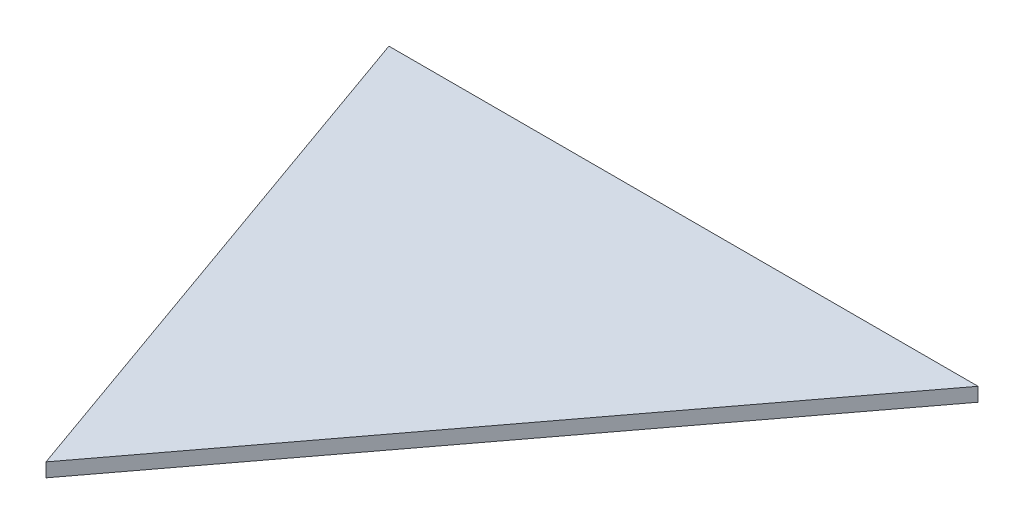
ISO-10303-21;
HEADER;
FILE_DESCRIPTION(('STEP AP214'),'2;1');
FILE_NAME('part.step','',(''),(''),'','','');
FILE_SCHEMA(('AUTOMOTIVE_DESIGN { 1 0 10303 214 1 1 1 1 }'));
ENDSEC;
DATA;
#1=APPLICATION_CONTEXT('core data for automotive mechanical design processes');
#2=APPLICATION_PROTOCOL_DEFINITION('international standard','automotive_design',2000,#1);
#3=PRODUCT_CONTEXT('',#1,'mechanical');
#4=PRODUCT('Part','Part','',(#3));
#5=PRODUCT_RELATED_PRODUCT_CATEGORY('part','',(#4));
#6=PRODUCT_DEFINITION_FORMATION('','',#4);
#7=PRODUCT_DEFINITION_CONTEXT('part definition',#1,'design');
#8=PRODUCT_DEFINITION('design','',#6,#7);
#9=PRODUCT_DEFINITION_SHAPE('','',#8);
#10=(LENGTH_UNIT() NAMED_UNIT(*) SI_UNIT(.MILLI.,.METRE.));
#11=(NAMED_UNIT(*) PLANE_ANGLE_UNIT() SI_UNIT($,.RADIAN.));
#12=(NAMED_UNIT(*) SI_UNIT($,.STERADIAN.) SOLID_ANGLE_UNIT());
#13=UNCERTAINTY_MEASURE_WITH_UNIT(LENGTH_MEASURE(1.E-05),#10,'distance_accuracy_value','');
#14=(GEOMETRIC_REPRESENTATION_CONTEXT(3) GLOBAL_UNCERTAINTY_ASSIGNED_CONTEXT((#13)) GLOBAL_UNIT_ASSIGNED_CONTEXT((#10,
#11,#12)) REPRESENTATION_CONTEXT('',''));
#15=CARTESIAN_POINT('',(0.,0.,0.));
#16=DIRECTION('',(0.,0.,1.));
#17=DIRECTION('',(1.,0.,0.));
#18=AXIS2_PLACEMENT_3D('',#15,#16,#17);
#19=CARTESIAN_POINT('',(-57.15,152.4,0.));
#20=DIRECTION('',(0.,0.,1.));
#21=DIRECTION('',(1.,0.,0.));
#22=AXIS2_PLACEMENT_3D('',#19,#20,#21);
#23=PLANE('',#22);
#24=DIRECTION('',(-1.,0.,0.));
#25=VECTOR('',#24,1.);
#26=CARTESIAN_POINT('',(224.536,145.785416666667,0.));
#27=LINE('',#26,#25);
#28=CARTESIAN_POINT('',(224.536,145.785416666667,0.));
#29=VERTEX_POINT('',#28);
#30=CARTESIAN_POINT('',(-57.15,145.785416666667,0.));
#31=VERTEX_POINT('',#30);
#32=EDGE_CURVE('E73',#29,#31,#27,.T.);
#33=ORIENTED_EDGE('',*,*,#32,.T.);
#34=DIRECTION('',(0.,-1.,0.));
#35=VECTOR('',#34,1.);
#36=CARTESIAN_POINT('',(-57.15,152.4,0.));
#37=LINE('',#36,#35);
#38=CARTESIAN_POINT('',(-57.15,152.4,0.));
#39=VERTEX_POINT('',#38);
#40=EDGE_CURVE('E93',#39,#31,#37,.T.);
#41=ORIENTED_EDGE('',*,*,#40,.F.);
#42=DIRECTION('',(-1.,0.,0.));
#43=VECTOR('',#42,1.);
#44=CARTESIAN_POINT('',(-57.15,152.4,0.));
#45=LINE('',#44,#43);
#46=CARTESIAN_POINT('',(224.536,152.4,0.));
#47=VERTEX_POINT('',#46);
#48=EDGE_CURVE('E91',#47,#39,#45,.T.);
#49=ORIENTED_EDGE('',*,*,#48,.F.);
#50=DIRECTION('',(0.,-1.,0.));
#51=VECTOR('',#50,1.);
#52=CARTESIAN_POINT('',(224.536,152.4,0.));
#53=LINE('',#52,#51);
#54=EDGE_CURVE('E49',#47,#29,#53,.T.);
#55=ORIENTED_EDGE('',*,*,#54,.T.);
#56=EDGE_LOOP('',(#33,#41,#49,#55));
#57=FACE_BOUND('',#56,.T.);
#58=ADVANCED_FACE('F40',(#57),#23,.F.);
#59=CARTESIAN_POINT('',(-24.3576833527357,152.4,196.753899883586));
#60=DIRECTION('',(0.986393923832144,0.,-0.164398987305357));
#61=DIRECTION('',(-0.164398987305357,0.,-0.986393923832144));
#62=AXIS2_PLACEMENT_3D('',#59,#60,#61);
#63=PLANE('',#62);
#64=DIRECTION('',(-0.157990501106673,0.276483376936678,-0.947943006640037));
#65=VECTOR('',#64,1.);
#66=CARTESIAN_POINT('',(-27.1533648645131,93.2913051795645,179.979810812922));
#67=LINE('',#66,#65);
#68=CARTESIAN_POINT('',(-24.3576833527357,88.3988625339542,196.753899883586));
#69=VERTEX_POINT('',#68);
#70=EDGE_CURVE('E78',#69,#31,#67,.T.);
#71=ORIENTED_EDGE('',*,*,#70,.F.);
#72=DIRECTION('',(0.,-1.,0.));
#73=VECTOR('',#72,1.);
#74=CARTESIAN_POINT('',(-24.3576833527357,152.4,196.753899883586));
#75=LINE('',#74,#73);
#76=CARTESIAN_POINT('',(-24.3576833527357,95.0134458672875,196.753899883586));
#77=VERTEX_POINT('',#76);
#78=EDGE_CURVE('E12',#77,#69,#75,.T.);
#79=ORIENTED_EDGE('',*,*,#78,.F.);
#80=DIRECTION('',(-0.157990501106673,0.276483376936678,-0.947943006640037));
#81=VECTOR('',#80,1.);
#82=CARTESIAN_POINT('',(-26.8644283070508,99.4002495373389,181.713430157695));
#83=LINE('',#82,#81);
#84=EDGE_CURVE('E60',#77,#39,#83,.T.);
#85=ORIENTED_EDGE('',*,*,#84,.T.);
#86=ORIENTED_EDGE('',*,*,#40,.T.);
#87=EDGE_LOOP('',(#71,#79,#85,#86));
#88=FACE_BOUND('',#87,.T.);
#89=ADVANCED_FACE('F42',(#88),#63,.F.);
#90=CARTESIAN_POINT('',(224.536,152.4,0.));
#91=DIRECTION('',(-0.620146840249803,0.,-0.784485752916001));
#92=DIRECTION('',(-0.784485752916001,0.,0.620146840249803));
#93=AXIS2_PLACEMENT_3D('',#90,#91,#92);
#94=PLANE('',#93);
#95=DIRECTION('',(-0.771959593647215,-0.177988048601137,0.61024473806104));
#96=VECTOR('',#95,1.);
#97=CARTESIAN_POINT('',(225.444840982936,145.99496498289,-0.718451369909775));
#98=LINE('',#97,#96);
#99=EDGE_CURVE('E76',#29,#69,#98,.T.);
#100=ORIENTED_EDGE('',*,*,#99,.F.);
#101=ORIENTED_EDGE('',*,*,#54,.F.);
#102=DIRECTION('',(-0.771959593647215,-0.177988048601137,0.61024473806104));
#103=VECTOR('',#102,1.);
#104=CARTESIAN_POINT('',(224.536,152.4,0.));
#105=LINE('',#104,#103);
#106=EDGE_CURVE('E56',#47,#77,#105,.T.);
#107=ORIENTED_EDGE('',*,*,#106,.T.);
#108=ORIENTED_EDGE('',*,*,#78,.T.);
#109=EDGE_LOOP('',(#100,#101,#107,#108));
#110=FACE_BOUND('',#109,.T.);
#111=ADVANCED_FACE('F86',(#110),#94,.F.);
#112=CARTESIAN_POINT('',(224.536,107.95,152.4));
#113=DIRECTION('',(0.,-0.96,-0.28));
#114=DIRECTION('',(0.,0.28,-0.96));
#115=AXIS2_PLACEMENT_3D('',#112,#113,#114);
#116=PLANE('',#115);
#117=ORIENTED_EDGE('',*,*,#106,.F.);
#118=ORIENTED_EDGE('',*,*,#48,.T.);
#119=ORIENTED_EDGE('',*,*,#84,.F.);
#120=EDGE_LOOP('',(#117,#118,#119));
#121=FACE_BOUND('',#120,.T.);
#122=ADVANCED_FACE('F110',(#121),#116,.F.);
#123=CARTESIAN_POINT('',(224.536,101.854,150.622));
#124=DIRECTION('',(0.,-0.96,-0.28));
#125=DIRECTION('',(0.,0.28,-0.96));
#126=AXIS2_PLACEMENT_3D('',#123,#124,#125);
#127=PLANE('',#126);
#128=ORIENTED_EDGE('',*,*,#70,.T.);
#129=ORIENTED_EDGE('',*,*,#32,.F.);
#130=ORIENTED_EDGE('',*,*,#99,.T.);
#131=EDGE_LOOP('',(#128,#129,#130));
#132=FACE_BOUND('',#131,.T.);
#133=ADVANCED_FACE('F75',(#132),#127,.T.);
#134=CLOSED_SHELL('',(#58,#89,#111,#122,#133));
#135=MANIFOLD_SOLID_BREP('B2',#134);
#136=ADVANCED_BREP_SHAPE_REPRESENTATION('',(#18,#135),#14);
#137=SHAPE_DEFINITION_REPRESENTATION(#9,#136);
ENDSEC;
END-ISO-10303-21;
